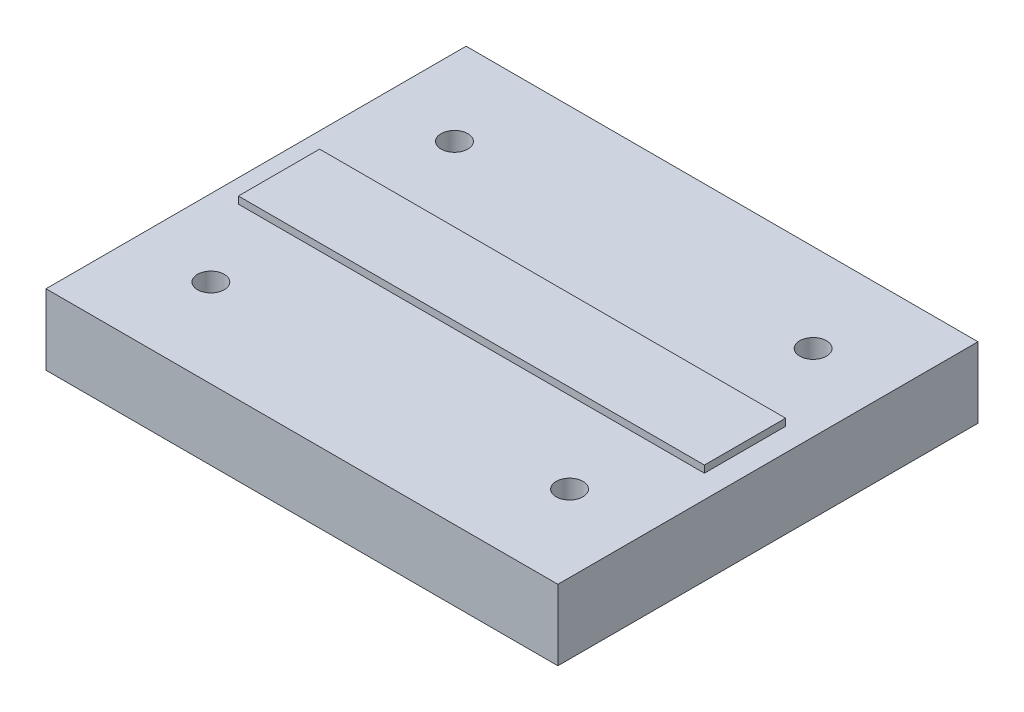
ISO-10303-21;
HEADER;
FILE_DESCRIPTION(('STEP AP214'),'2;1');
FILE_NAME('part.step','',(''),(''),'','','');
FILE_SCHEMA(('AUTOMOTIVE_DESIGN { 1 0 10303 214 1 1 1 1 }'));
ENDSEC;
DATA;
#1=APPLICATION_CONTEXT('core data for automotive mechanical design processes');
#2=APPLICATION_PROTOCOL_DEFINITION('international standard','automotive_design',2000,#1);
#3=PRODUCT_CONTEXT('',#1,'mechanical');
#4=PRODUCT('Part','Part','',(#3));
#5=PRODUCT_RELATED_PRODUCT_CATEGORY('part','',(#4));
#6=PRODUCT_DEFINITION_FORMATION('','',#4);
#7=PRODUCT_DEFINITION_CONTEXT('part definition',#1,'design');
#8=PRODUCT_DEFINITION('design','',#6,#7);
#9=PRODUCT_DEFINITION_SHAPE('','',#8);
#10=(LENGTH_UNIT() NAMED_UNIT(*) SI_UNIT(.MILLI.,.METRE.));
#11=(NAMED_UNIT(*) PLANE_ANGLE_UNIT() SI_UNIT($,.RADIAN.));
#12=(NAMED_UNIT(*) SI_UNIT($,.STERADIAN.) SOLID_ANGLE_UNIT());
#13=UNCERTAINTY_MEASURE_WITH_UNIT(LENGTH_MEASURE(1.E-05),#10,'distance_accuracy_value','');
#14=(GEOMETRIC_REPRESENTATION_CONTEXT(3) GLOBAL_UNCERTAINTY_ASSIGNED_CONTEXT((#13)) GLOBAL_UNIT_ASSIGNED_CONTEXT((#10,
#11,#12)) REPRESENTATION_CONTEXT('',''));
#15=CARTESIAN_POINT('',(0.,0.,0.));
#16=DIRECTION('',(0.,0.,1.));
#17=DIRECTION('',(1.,0.,0.));
#18=AXIS2_PLACEMENT_3D('',#15,#16,#17);
#19=CARTESIAN_POINT('',(0.,10.,0.));
#20=DIRECTION('',(0.,-1.,0.));
#21=DIRECTION('',(0.,0.,-1.));
#22=AXIS2_PLACEMENT_3D('',#19,#20,#21);
#23=PLANE('',#22);
#24=CARTESIAN_POINT('',(10.85,10.,-47.));
#25=DIRECTION('',(0.,1.,0.));
#26=DIRECTION('',(0.,0.,1.));
#27=AXIS2_PLACEMENT_3D('',#24,#25,#26);
#28=CIRCLE('',#27,1.89864999999999);
#29=CARTESIAN_POINT('',(10.85,10.,-45.10135));
#30=VERTEX_POINT('',#29);
#31=EDGE_CURVE('E307',#30,#30,#28,.T.);
#32=ORIENTED_EDGE('',*,*,#31,.F.);
#33=EDGE_LOOP('',(#32));
#34=FACE_BOUND('',#33,.T.);
#35=CARTESIAN_POINT('',(61.65,10.,-47.));
#36=DIRECTION('',(0.,1.,0.));
#37=DIRECTION('',(0.,0.,1.));
#38=AXIS2_PLACEMENT_3D('',#35,#36,#37);
#39=CIRCLE('',#38,1.89864999999999);
#40=CARTESIAN_POINT('',(61.65,10.,-45.10135));
#41=VERTEX_POINT('',#40);
#42=EDGE_CURVE('E309',#41,#41,#39,.T.);
#43=ORIENTED_EDGE('',*,*,#42,.F.);
#44=EDGE_LOOP('',(#43));
#45=FACE_BOUND('',#44,.T.);
#46=CARTESIAN_POINT('',(10.85,10.,-12.5));
#47=DIRECTION('',(0.,1.,0.));
#48=DIRECTION('',(0.,0.,1.));
#49=AXIS2_PLACEMENT_3D('',#46,#47,#48);
#50=CIRCLE('',#49,1.89864999999999);
#51=CARTESIAN_POINT('',(10.85,10.,-10.60135));
#52=VERTEX_POINT('',#51);
#53=EDGE_CURVE('E317',#52,#52,#50,.T.);
#54=ORIENTED_EDGE('',*,*,#53,.F.);
#55=EDGE_LOOP('',(#54));
#56=FACE_BOUND('',#55,.T.);
#57=CARTESIAN_POINT('',(61.65,10.,-12.5));
#58=DIRECTION('',(0.,1.,0.));
#59=DIRECTION('',(0.,0.,1.));
#60=AXIS2_PLACEMENT_3D('',#57,#58,#59);
#61=CIRCLE('',#60,1.89864999999999);
#62=CARTESIAN_POINT('',(61.65,10.,-10.60135));
#63=VERTEX_POINT('',#62);
#64=EDGE_CURVE('E323',#63,#63,#61,.T.);
#65=ORIENTED_EDGE('',*,*,#64,.F.);
#66=EDGE_LOOP('',(#65));
#67=FACE_BOUND('',#66,.T.);
#68=DIRECTION('',(0.,0.,1.));
#69=VECTOR('',#68,1.);
#70=CARTESIAN_POINT('',(0.,10.,0.));
#71=LINE('',#70,#69);
#72=CARTESIAN_POINT('',(0.,10.,-59.5));
#73=VERTEX_POINT('',#72);
#74=CARTESIAN_POINT('',(0.,10.,0.));
#75=VERTEX_POINT('',#74);
#76=EDGE_CURVE('E128',#73,#75,#71,.T.);
#77=ORIENTED_EDGE('',*,*,#76,.T.);
#78=DIRECTION('',(1.,0.,0.));
#79=VECTOR('',#78,1.);
#80=CARTESIAN_POINT('',(0.,10.,0.));
#81=LINE('',#80,#79);
#82=CARTESIAN_POINT('',(72.5,10.,0.));
#83=VERTEX_POINT('',#82);
#84=EDGE_CURVE('E131',#75,#83,#81,.T.);
#85=ORIENTED_EDGE('',*,*,#84,.T.);
#86=DIRECTION('',(0.,0.,-1.));
#87=VECTOR('',#86,1.);
#88=CARTESIAN_POINT('',(72.5,10.,0.));
#89=LINE('',#88,#87);
#90=CARTESIAN_POINT('',(72.5,10.,-59.5));
#91=VERTEX_POINT('',#90);
#92=EDGE_CURVE('E134',#83,#91,#89,.T.);
#93=ORIENTED_EDGE('',*,*,#92,.T.);
#94=DIRECTION('',(-1.,0.,0.));
#95=VECTOR('',#94,1.);
#96=CARTESIAN_POINT('',(0.,10.,-59.5));
#97=LINE('',#96,#95);
#98=EDGE_CURVE('E136',#91,#73,#97,.T.);
#99=ORIENTED_EDGE('',*,*,#98,.T.);
#100=EDGE_LOOP('',(#77,#85,#93,#99));
#101=FACE_BOUND('',#100,.T.);
#102=DIRECTION('',(0.,0.,1.));
#103=VECTOR('',#102,1.);
#104=CARTESIAN_POINT('',(3.24999999999999,10.,-35.5));
#105=LINE('',#104,#103);
#106=CARTESIAN_POINT('',(3.24999999999999,10.,-35.5));
#107=VERTEX_POINT('',#106);
#108=CARTESIAN_POINT('',(3.24999999999999,10.,-24.));
#109=VERTEX_POINT('',#108);
#110=EDGE_CURVE('E118',#107,#109,#105,.T.);
#111=ORIENTED_EDGE('',*,*,#110,.F.);
#112=DIRECTION('',(-1.,0.,0.));
#113=VECTOR('',#112,1.);
#114=CARTESIAN_POINT('',(3.24999999999999,10.,-35.5));
#115=LINE('',#114,#113);
#116=CARTESIAN_POINT('',(69.25,10.,-35.5));
#117=VERTEX_POINT('',#116);
#118=EDGE_CURVE('E115',#117,#107,#115,.T.);
#119=ORIENTED_EDGE('',*,*,#118,.F.);
#120=DIRECTION('',(0.,0.,-1.));
#121=VECTOR('',#120,1.);
#122=CARTESIAN_POINT('',(69.25,10.,-35.5));
#123=LINE('',#122,#121);
#124=CARTESIAN_POINT('',(69.25,10.,-24.));
#125=VERTEX_POINT('',#124);
#126=EDGE_CURVE('E53',#125,#117,#123,.T.);
#127=ORIENTED_EDGE('',*,*,#126,.F.);
#128=DIRECTION('',(1.,0.,0.));
#129=VECTOR('',#128,1.);
#130=CARTESIAN_POINT('',(3.24999999999999,10.,-24.));
#131=LINE('',#130,#129);
#132=EDGE_CURVE('E48',#109,#125,#131,.T.);
#133=ORIENTED_EDGE('',*,*,#132,.F.);
#134=EDGE_LOOP('',(#111,#119,#127,#133));
#135=FACE_BOUND('',#134,.T.);
#136=ADVANCED_FACE('F33',(#34,#45,#56,#67,#101,#135),#23,.F.);
#137=CARTESIAN_POINT('',(0.,10.,0.));
#138=DIRECTION('',(1.,0.,0.));
#139=DIRECTION('',(0.,0.,-1.));
#140=AXIS2_PLACEMENT_3D('',#137,#138,#139);
#141=PLANE('',#140);
#142=DIRECTION('',(0.,0.,1.));
#143=VECTOR('',#142,1.);
#144=CARTESIAN_POINT('',(0.,0.,0.));
#145=LINE('',#144,#143);
#146=CARTESIAN_POINT('',(0.,0.,-59.5));
#147=VERTEX_POINT('',#146);
#148=CARTESIAN_POINT('',(0.,0.,0.));
#149=VERTEX_POINT('',#148);
#150=EDGE_CURVE('E119',#147,#149,#145,.T.);
#151=ORIENTED_EDGE('',*,*,#150,.T.);
#152=DIRECTION('',(0.,-1.,0.));
#153=VECTOR('',#152,1.);
#154=CARTESIAN_POINT('',(0.,10.,0.));
#155=LINE('',#154,#153);
#156=EDGE_CURVE('E11',#75,#149,#155,.T.);
#157=ORIENTED_EDGE('',*,*,#156,.F.);
#158=ORIENTED_EDGE('',*,*,#76,.F.);
#159=DIRECTION('',(0.,-1.,0.));
#160=VECTOR('',#159,1.);
#161=CARTESIAN_POINT('',(0.,10.,-59.5));
#162=LINE('',#161,#160);
#163=EDGE_CURVE('E137',#73,#147,#162,.T.);
#164=ORIENTED_EDGE('',*,*,#163,.T.);
#165=EDGE_LOOP('',(#151,#157,#158,#164));
#166=FACE_BOUND('',#165,.T.);
#167=ADVANCED_FACE('F35',(#166),#141,.F.);
#168=CARTESIAN_POINT('',(0.,10.,0.));
#169=DIRECTION('',(0.,0.,-1.));
#170=DIRECTION('',(-1.,0.,0.));
#171=AXIS2_PLACEMENT_3D('',#168,#169,#170);
#172=PLANE('',#171);
#173=DIRECTION('',(1.,0.,0.));
#174=VECTOR('',#173,1.);
#175=CARTESIAN_POINT('',(0.,0.,0.));
#176=LINE('',#175,#174);
#177=CARTESIAN_POINT('',(72.5,0.,0.));
#178=VERTEX_POINT('',#177);
#179=EDGE_CURVE('E122',#149,#178,#176,.T.);
#180=ORIENTED_EDGE('',*,*,#179,.T.);
#181=DIRECTION('',(0.,-1.,0.));
#182=VECTOR('',#181,1.);
#183=CARTESIAN_POINT('',(72.5,10.,0.));
#184=LINE('',#183,#182);
#185=EDGE_CURVE('E41',#83,#178,#184,.T.);
#186=ORIENTED_EDGE('',*,*,#185,.F.);
#187=ORIENTED_EDGE('',*,*,#84,.F.);
#188=ORIENTED_EDGE('',*,*,#156,.T.);
#189=EDGE_LOOP('',(#180,#186,#187,#188));
#190=FACE_BOUND('',#189,.T.);
#191=ADVANCED_FACE('F167',(#190),#172,.F.);
#192=CARTESIAN_POINT('',(72.5,10.,0.));
#193=DIRECTION('',(-1.,0.,0.));
#194=DIRECTION('',(0.,0.,1.));
#195=AXIS2_PLACEMENT_3D('',#192,#193,#194);
#196=PLANE('',#195);
#197=DIRECTION('',(0.,0.,-1.));
#198=VECTOR('',#197,1.);
#199=CARTESIAN_POINT('',(72.5,0.,0.));
#200=LINE('',#199,#198);
#201=CARTESIAN_POINT('',(72.5,0.,-59.5));
#202=VERTEX_POINT('',#201);
#203=EDGE_CURVE('E140',#178,#202,#200,.T.);
#204=ORIENTED_EDGE('',*,*,#203,.T.);
#205=DIRECTION('',(0.,-1.,0.));
#206=VECTOR('',#205,1.);
#207=CARTESIAN_POINT('',(72.5,10.,-59.5));
#208=LINE('',#207,#206);
#209=EDGE_CURVE('E145',#91,#202,#208,.T.);
#210=ORIENTED_EDGE('',*,*,#209,.F.);
#211=ORIENTED_EDGE('',*,*,#92,.F.);
#212=ORIENTED_EDGE('',*,*,#185,.T.);
#213=EDGE_LOOP('',(#204,#210,#211,#212));
#214=FACE_BOUND('',#213,.T.);
#215=ADVANCED_FACE('F152',(#214),#196,.F.);
#216=CARTESIAN_POINT('',(0.,10.,-59.5));
#217=DIRECTION('',(0.,0.,1.));
#218=DIRECTION('',(1.,0.,0.));
#219=AXIS2_PLACEMENT_3D('',#216,#217,#218);
#220=PLANE('',#219);
#221=DIRECTION('',(-1.,0.,0.));
#222=VECTOR('',#221,1.);
#223=CARTESIAN_POINT('',(0.,0.,-59.5));
#224=LINE('',#223,#222);
#225=EDGE_CURVE('E132',#202,#147,#224,.T.);
#226=ORIENTED_EDGE('',*,*,#225,.T.);
#227=ORIENTED_EDGE('',*,*,#163,.F.);
#228=ORIENTED_EDGE('',*,*,#98,.F.);
#229=ORIENTED_EDGE('',*,*,#209,.T.);
#230=EDGE_LOOP('',(#226,#227,#228,#229));
#231=FACE_BOUND('',#230,.T.);
#232=ADVANCED_FACE('F161',(#231),#220,.F.);
#233=CARTESIAN_POINT('',(0.,0.,0.));
#234=DIRECTION('',(0.,-1.,0.));
#235=DIRECTION('',(0.,0.,-1.));
#236=AXIS2_PLACEMENT_3D('',#233,#234,#235);
#237=PLANE('',#236);
#238=CARTESIAN_POINT('',(10.85,0.,-47.));
#239=DIRECTION('',(0.,1.,0.));
#240=DIRECTION('',(0.,0.,1.));
#241=AXIS2_PLACEMENT_3D('',#238,#239,#240);
#242=CIRCLE('',#241,1.89864999999999);
#243=CARTESIAN_POINT('',(10.85,0.,-45.10135));
#244=VERTEX_POINT('',#243);
#245=EDGE_CURVE('E305',#244,#244,#242,.T.);
#246=ORIENTED_EDGE('',*,*,#245,.T.);
#247=EDGE_LOOP('',(#246));
#248=FACE_BOUND('',#247,.T.);
#249=CARTESIAN_POINT('',(61.65,0.,-47.));
#250=DIRECTION('',(0.,1.,0.));
#251=DIRECTION('',(0.,0.,1.));
#252=AXIS2_PLACEMENT_3D('',#249,#250,#251);
#253=CIRCLE('',#252,1.89864999999999);
#254=CARTESIAN_POINT('',(61.65,0.,-45.10135));
#255=VERTEX_POINT('',#254);
#256=EDGE_CURVE('E314',#255,#255,#253,.T.);
#257=ORIENTED_EDGE('',*,*,#256,.T.);
#258=EDGE_LOOP('',(#257));
#259=FACE_BOUND('',#258,.T.);
#260=CARTESIAN_POINT('',(10.85,0.,-12.5));
#261=DIRECTION('',(0.,1.,0.));
#262=DIRECTION('',(0.,0.,1.));
#263=AXIS2_PLACEMENT_3D('',#260,#261,#262);
#264=CIRCLE('',#263,1.89864999999999);
#265=CARTESIAN_POINT('',(10.85,0.,-10.60135));
#266=VERTEX_POINT('',#265);
#267=EDGE_CURVE('E320',#266,#266,#264,.T.);
#268=ORIENTED_EDGE('',*,*,#267,.T.);
#269=EDGE_LOOP('',(#268));
#270=FACE_BOUND('',#269,.T.);
#271=CARTESIAN_POINT('',(61.65,0.,-12.5));
#272=DIRECTION('',(0.,1.,0.));
#273=DIRECTION('',(0.,0.,1.));
#274=AXIS2_PLACEMENT_3D('',#271,#272,#273);
#275=CIRCLE('',#274,1.89864999999999);
#276=CARTESIAN_POINT('',(61.65,0.,-10.60135));
#277=VERTEX_POINT('',#276);
#278=EDGE_CURVE('E326',#277,#277,#275,.T.);
#279=ORIENTED_EDGE('',*,*,#278,.T.);
#280=EDGE_LOOP('',(#279));
#281=FACE_BOUND('',#280,.T.);
#282=ORIENTED_EDGE('',*,*,#150,.F.);
#283=ORIENTED_EDGE('',*,*,#225,.F.);
#284=ORIENTED_EDGE('',*,*,#203,.F.);
#285=ORIENTED_EDGE('',*,*,#179,.F.);
#286=EDGE_LOOP('',(#282,#283,#284,#285));
#287=FACE_BOUND('',#286,.T.);
#288=ADVANCED_FACE('F158',(#248,#259,#270,#281,#287),#237,.T.);
#289=CARTESIAN_POINT('',(3.24999999999999,11.,-35.5));
#290=DIRECTION('',(1.,0.,0.));
#291=DIRECTION('',(0.,0.,-1.));
#292=AXIS2_PLACEMENT_3D('',#289,#290,#291);
#293=PLANE('',#292);
#294=ORIENTED_EDGE('',*,*,#110,.T.);
#295=DIRECTION('',(0.,-1.,0.));
#296=VECTOR('',#295,1.);
#297=CARTESIAN_POINT('',(3.24999999999999,11.,-24.));
#298=LINE('',#297,#296);
#299=CARTESIAN_POINT('',(3.24999999999999,11.,-24.));
#300=VERTEX_POINT('',#299);
#301=EDGE_CURVE('E99',#300,#109,#298,.T.);
#302=ORIENTED_EDGE('',*,*,#301,.F.);
#303=DIRECTION('',(0.,0.,1.));
#304=VECTOR('',#303,1.);
#305=CARTESIAN_POINT('',(3.24999999999999,11.,-35.5));
#306=LINE('',#305,#304);
#307=CARTESIAN_POINT('',(3.24999999999999,11.,-35.5));
#308=VERTEX_POINT('',#307);
#309=EDGE_CURVE('E106',#308,#300,#306,.T.);
#310=ORIENTED_EDGE('',*,*,#309,.F.);
#311=DIRECTION('',(0.,-1.,0.));
#312=VECTOR('',#311,1.);
#313=CARTESIAN_POINT('',(3.24999999999999,11.,-35.5));
#314=LINE('',#313,#312);
#315=EDGE_CURVE('E331',#308,#107,#314,.T.);
#316=ORIENTED_EDGE('',*,*,#315,.T.);
#317=EDGE_LOOP('',(#294,#302,#310,#316));
#318=FACE_BOUND('',#317,.T.);
#319=ADVANCED_FACE('F117',(#318),#293,.F.);
#320=CARTESIAN_POINT('',(3.24999999999999,11.,-24.));
#321=DIRECTION('',(0.,0.,-1.));
#322=DIRECTION('',(-1.,0.,0.));
#323=AXIS2_PLACEMENT_3D('',#320,#321,#322);
#324=PLANE('',#323);
#325=ORIENTED_EDGE('',*,*,#132,.T.);
#326=DIRECTION('',(0.,-1.,0.));
#327=VECTOR('',#326,1.);
#328=CARTESIAN_POINT('',(69.25,11.,-24.));
#329=LINE('',#328,#327);
#330=CARTESIAN_POINT('',(69.25,11.,-24.));
#331=VERTEX_POINT('',#330);
#332=EDGE_CURVE('E102',#331,#125,#329,.T.);
#333=ORIENTED_EDGE('',*,*,#332,.F.);
#334=DIRECTION('',(1.,0.,0.));
#335=VECTOR('',#334,1.);
#336=CARTESIAN_POINT('',(3.24999999999999,11.,-24.));
#337=LINE('',#336,#335);
#338=EDGE_CURVE('E95',#300,#331,#337,.T.);
#339=ORIENTED_EDGE('',*,*,#338,.F.);
#340=ORIENTED_EDGE('',*,*,#301,.T.);
#341=EDGE_LOOP('',(#325,#333,#339,#340));
#342=FACE_BOUND('',#341,.T.);
#343=ADVANCED_FACE('F97',(#342),#324,.F.);
#344=CARTESIAN_POINT('',(69.25,11.,-35.5));
#345=DIRECTION('',(-1.,0.,0.));
#346=DIRECTION('',(0.,0.,1.));
#347=AXIS2_PLACEMENT_3D('',#344,#345,#346);
#348=PLANE('',#347);
#349=ORIENTED_EDGE('',*,*,#126,.T.);
#350=DIRECTION('',(0.,-1.,0.));
#351=VECTOR('',#350,1.);
#352=CARTESIAN_POINT('',(69.25,11.,-35.5));
#353=LINE('',#352,#351);
#354=CARTESIAN_POINT('',(69.25,11.,-35.5));
#355=VERTEX_POINT('',#354);
#356=EDGE_CURVE('E124',#355,#117,#353,.T.);
#357=ORIENTED_EDGE('',*,*,#356,.F.);
#358=DIRECTION('',(0.,0.,-1.));
#359=VECTOR('',#358,1.);
#360=CARTESIAN_POINT('',(69.25,11.,-35.5));
#361=LINE('',#360,#359);
#362=EDGE_CURVE('E105',#331,#355,#361,.T.);
#363=ORIENTED_EDGE('',*,*,#362,.F.);
#364=ORIENTED_EDGE('',*,*,#332,.T.);
#365=EDGE_LOOP('',(#349,#357,#363,#364));
#366=FACE_BOUND('',#365,.T.);
#367=ADVANCED_FACE('F208',(#366),#348,.F.);
#368=CARTESIAN_POINT('',(3.24999999999999,11.,-35.5));
#369=DIRECTION('',(0.,0.,1.));
#370=DIRECTION('',(1.,0.,0.));
#371=AXIS2_PLACEMENT_3D('',#368,#369,#370);
#372=PLANE('',#371);
#373=ORIENTED_EDGE('',*,*,#118,.T.);
#374=ORIENTED_EDGE('',*,*,#315,.F.);
#375=DIRECTION('',(-1.,0.,0.));
#376=VECTOR('',#375,1.);
#377=CARTESIAN_POINT('',(3.24999999999999,11.,-35.5));
#378=LINE('',#377,#376);
#379=EDGE_CURVE('E111',#355,#308,#378,.T.);
#380=ORIENTED_EDGE('',*,*,#379,.F.);
#381=ORIENTED_EDGE('',*,*,#356,.T.);
#382=EDGE_LOOP('',(#373,#374,#380,#381));
#383=FACE_BOUND('',#382,.T.);
#384=ADVANCED_FACE('F214',(#383),#372,.F.);
#385=CARTESIAN_POINT('',(0.,11.,0.));
#386=DIRECTION('',(0.,1.,0.));
#387=DIRECTION('',(0.,0.,1.));
#388=AXIS2_PLACEMENT_3D('',#385,#386,#387);
#389=PLANE('',#388);
#390=ORIENTED_EDGE('',*,*,#309,.T.);
#391=ORIENTED_EDGE('',*,*,#338,.T.);
#392=ORIENTED_EDGE('',*,*,#362,.T.);
#393=ORIENTED_EDGE('',*,*,#379,.T.);
#394=EDGE_LOOP('',(#390,#391,#392,#393));
#395=FACE_BOUND('',#394,.T.);
#396=ADVANCED_FACE('F109',(#395),#389,.T.);
#397=CARTESIAN_POINT('',(61.65,10.,-12.5));
#398=DIRECTION('',(0.,1.,0.));
#399=DIRECTION('',(0.,0.,1.));
#400=AXIS2_PLACEMENT_3D('',#397,#398,#399);
#401=CYLINDRICAL_SURFACE('',#400,1.89864999999999);
#402=ORIENTED_EDGE('',*,*,#278,.F.);
#403=EDGE_LOOP('',(#402));
#404=FACE_BOUND('',#403,.T.);
#405=ORIENTED_EDGE('',*,*,#64,.T.);
#406=EDGE_LOOP('',(#405));
#407=FACE_BOUND('',#406,.T.);
#408=ADVANCED_FACE('F229',(#404,#407),#401,.F.);
#409=CARTESIAN_POINT('',(10.85,10.,-12.5));
#410=DIRECTION('',(0.,1.,0.));
#411=DIRECTION('',(0.,0.,1.));
#412=AXIS2_PLACEMENT_3D('',#409,#410,#411);
#413=CYLINDRICAL_SURFACE('',#412,1.89864999999999);
#414=ORIENTED_EDGE('',*,*,#267,.F.);
#415=EDGE_LOOP('',(#414));
#416=FACE_BOUND('',#415,.T.);
#417=ORIENTED_EDGE('',*,*,#53,.T.);
#418=EDGE_LOOP('',(#417));
#419=FACE_BOUND('',#418,.T.);
#420=ADVANCED_FACE('F235',(#416,#419),#413,.F.);
#421=CARTESIAN_POINT('',(61.65,10.,-47.));
#422=DIRECTION('',(0.,1.,0.));
#423=DIRECTION('',(0.,0.,1.));
#424=AXIS2_PLACEMENT_3D('',#421,#422,#423);
#425=CYLINDRICAL_SURFACE('',#424,1.89864999999999);
#426=ORIENTED_EDGE('',*,*,#256,.F.);
#427=EDGE_LOOP('',(#426));
#428=FACE_BOUND('',#427,.T.);
#429=ORIENTED_EDGE('',*,*,#42,.T.);
#430=EDGE_LOOP('',(#429));
#431=FACE_BOUND('',#430,.T.);
#432=ADVANCED_FACE('F243',(#428,#431),#425,.F.);
#433=CARTESIAN_POINT('',(10.85,10.,-47.));
#434=DIRECTION('',(0.,1.,0.));
#435=DIRECTION('',(0.,0.,1.));
#436=AXIS2_PLACEMENT_3D('',#433,#434,#435);
#437=CYLINDRICAL_SURFACE('',#436,1.89864999999999);
#438=ORIENTED_EDGE('',*,*,#245,.F.);
#439=EDGE_LOOP('',(#438));
#440=FACE_BOUND('',#439,.T.);
#441=ORIENTED_EDGE('',*,*,#31,.T.);
#442=EDGE_LOOP('',(#441));
#443=FACE_BOUND('',#442,.T.);
#444=ADVANCED_FACE('F251',(#440,#443),#437,.F.);
#445=CLOSED_SHELL('',(#136,#167,#191,#215,#232,#288,#319,#343,#367,#384,#396,#408,#420,#432,#444));
#446=MANIFOLD_SOLID_BREP('B2',#445);
#447=ADVANCED_BREP_SHAPE_REPRESENTATION('',(#18,#446),#14);
#448=SHAPE_DEFINITION_REPRESENTATION(#9,#447);
ENDSEC;
END-ISO-10303-21;
